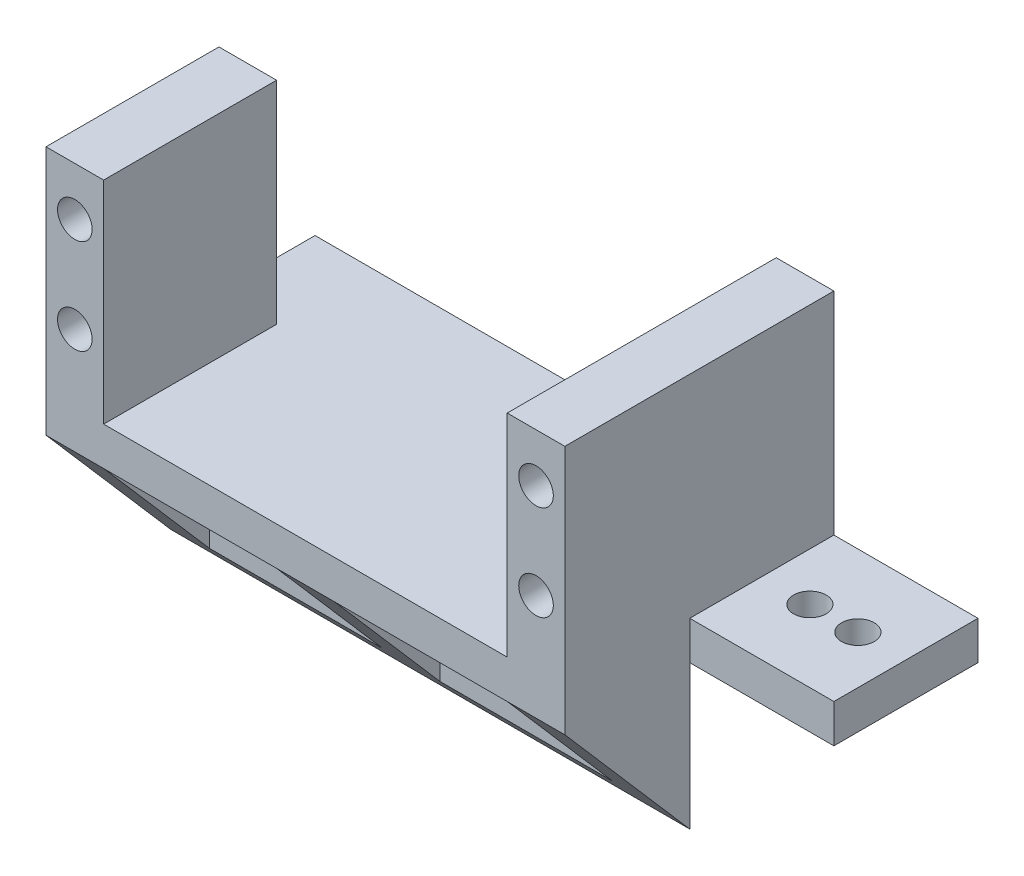
ISO-10303-21;
HEADER;
FILE_DESCRIPTION(('STEP AP214'),'2;1');
FILE_NAME('part.step','',(''),(''),'','','');
FILE_SCHEMA(('AUTOMOTIVE_DESIGN { 1 0 10303 214 1 1 1 1 }'));
ENDSEC;
DATA;
#1=APPLICATION_CONTEXT('core data for automotive mechanical design processes');
#2=APPLICATION_PROTOCOL_DEFINITION('international standard','automotive_design',2000,#1);
#3=PRODUCT_CONTEXT('',#1,'mechanical');
#4=PRODUCT('Part','Part','',(#3));
#5=PRODUCT_RELATED_PRODUCT_CATEGORY('part','',(#4));
#6=PRODUCT_DEFINITION_FORMATION('','',#4);
#7=PRODUCT_DEFINITION_CONTEXT('part definition',#1,'design');
#8=PRODUCT_DEFINITION('design','',#6,#7);
#9=PRODUCT_DEFINITION_SHAPE('','',#8);
#10=(LENGTH_UNIT() NAMED_UNIT(*) SI_UNIT(.MILLI.,.METRE.));
#11=(NAMED_UNIT(*) PLANE_ANGLE_UNIT() SI_UNIT($,.RADIAN.));
#12=(NAMED_UNIT(*) SI_UNIT($,.STERADIAN.) SOLID_ANGLE_UNIT());
#13=UNCERTAINTY_MEASURE_WITH_UNIT(LENGTH_MEASURE(1.E-05),#10,'distance_accuracy_value','');
#14=(GEOMETRIC_REPRESENTATION_CONTEXT(3) GLOBAL_UNCERTAINTY_ASSIGNED_CONTEXT((#13)) GLOBAL_UNIT_ASSIGNED_CONTEXT((#10,
#11,#12)) REPRESENTATION_CONTEXT('',''));
#15=CARTESIAN_POINT('',(0.,0.,0.));
#16=DIRECTION('',(0.,0.,1.));
#17=DIRECTION('',(1.,0.,0.));
#18=AXIS2_PLACEMENT_3D('',#15,#16,#17);
#19=CARTESIAN_POINT('',(0.,0.,-26.));
#20=DIRECTION('',(0.,0.,-1.));
#21=DIRECTION('',(1.,0.,0.));
#22=AXIS2_PLACEMENT_3D('',#19,#20,#21);
#23=PLANE('',#22);
#24=DIRECTION('',(0.,-1.,0.));
#25=VECTOR('',#24,1.);
#26=CARTESIAN_POINT('',(27.,26.,-26.));
#27=LINE('',#26,#25);
#28=CARTESIAN_POINT('',(27.,4.00000000000001,-26.));
#29=VERTEX_POINT('',#28);
#30=CARTESIAN_POINT('',(27.,0.,-26.));
#31=VERTEX_POINT('',#30);
#32=EDGE_CURVE('E294',#29,#31,#27,.T.);
#33=ORIENTED_EDGE('',*,*,#32,.T.);
#34=DIRECTION('',(-1.,0.,0.));
#35=VECTOR('',#34,1.);
#36=CARTESIAN_POINT('',(0.,0.,-26.));
#37=LINE('',#36,#35);
#38=CARTESIAN_POINT('',(42.,0.,-26.));
#39=VERTEX_POINT('',#38);
#40=EDGE_CURVE('E301',#39,#31,#37,.T.);
#41=ORIENTED_EDGE('',*,*,#40,.F.);
#42=DIRECTION('',(0.,-1.,0.));
#43=VECTOR('',#42,1.);
#44=CARTESIAN_POINT('',(42.,0.,-26.));
#45=LINE('',#44,#43);
#46=CARTESIAN_POINT('',(42.,4.00000000000001,-26.));
#47=VERTEX_POINT('',#46);
#48=EDGE_CURVE('E324',#47,#39,#45,.T.);
#49=ORIENTED_EDGE('',*,*,#48,.F.);
#50=DIRECTION('',(1.,0.,0.));
#51=VECTOR('',#50,1.);
#52=CARTESIAN_POINT('',(0.,4.00000000000001,-26.));
#53=LINE('',#52,#51);
#54=EDGE_CURVE('E306',#29,#47,#53,.T.);
#55=ORIENTED_EDGE('',*,*,#54,.F.);
#56=EDGE_LOOP('',(#33,#41,#49,#55));
#57=FACE_BOUND('',#56,.T.);
#58=ADVANCED_FACE('F37',(#57),#23,.F.);
#59=CARTESIAN_POINT('',(0.,0.,-41.));
#60=DIRECTION('',(0.,-1.,0.));
#61=DIRECTION('',(1.,0.,0.));
#62=AXIS2_PLACEMENT_3D('',#59,#60,#61);
#63=PLANE('',#62);
#64=DIRECTION('',(-1.,0.,0.));
#65=VECTOR('',#64,1.);
#66=CARTESIAN_POINT('',(27.,0.,-26.));
#67=LINE('',#66,#65);
#68=CARTESIAN_POINT('',(-27.,0.,-26.));
#69=VERTEX_POINT('',#68);
#70=EDGE_CURVE('E219',#31,#69,#67,.T.);
#71=ORIENTED_EDGE('',*,*,#70,.T.);
#72=DIRECTION('',(0.,0.,-1.));
#73=VECTOR('',#72,1.);
#74=CARTESIAN_POINT('',(-27.,0.,-13.));
#75=LINE('',#74,#73);
#76=CARTESIAN_POINT('',(-27.,0.,-41.));
#77=VERTEX_POINT('',#76);
#78=EDGE_CURVE('E293',#69,#77,#75,.T.);
#79=ORIENTED_EDGE('',*,*,#78,.T.);
#80=DIRECTION('',(-1.,0.,0.));
#81=VECTOR('',#80,1.);
#82=CARTESIAN_POINT('',(0.,0.,-41.));
#83=LINE('',#82,#81);
#84=CARTESIAN_POINT('',(42.,0.,-41.));
#85=VERTEX_POINT('',#84);
#86=EDGE_CURVE('E302',#85,#77,#83,.T.);
#87=ORIENTED_EDGE('',*,*,#86,.F.);
#88=DIRECTION('',(0.,0.,1.));
#89=VECTOR('',#88,1.);
#90=CARTESIAN_POINT('',(42.,0.,-41.));
#91=LINE('',#90,#89);
#92=EDGE_CURVE('E298',#85,#39,#91,.T.);
#93=ORIENTED_EDGE('',*,*,#92,.T.);
#94=ORIENTED_EDGE('',*,*,#40,.T.);
#95=EDGE_LOOP('',(#71,#79,#87,#93,#94));
#96=FACE_BOUND('',#95,.T.);
#97=CARTESIAN_POINT('',(37.,0.,-33.5));
#98=DIRECTION('',(0.,1.,0.));
#99=DIRECTION('',(1.,0.,0.));
#100=AXIS2_PLACEMENT_3D('',#97,#98,#99);
#101=CIRCLE('',#100,1.7);
#102=CARTESIAN_POINT('',(38.7,0.,-33.5));
#103=VERTEX_POINT('',#102);
#104=EDGE_CURVE('E246',#103,#103,#101,.T.);
#105=ORIENTED_EDGE('',*,*,#104,.T.);
#106=EDGE_LOOP('',(#105));
#107=FACE_BOUND('',#106,.T.);
#108=CARTESIAN_POINT('',(32.,0.,-33.5));
#109=DIRECTION('',(0.,1.,0.));
#110=DIRECTION('',(1.,0.,0.));
#111=AXIS2_PLACEMENT_3D('',#108,#109,#110);
#112=CIRCLE('',#111,1.7);
#113=CARTESIAN_POINT('',(33.7,0.,-33.5));
#114=VERTEX_POINT('',#113);
#115=EDGE_CURVE('E241',#114,#114,#112,.T.);
#116=ORIENTED_EDGE('',*,*,#115,.T.);
#117=EDGE_LOOP('',(#116));
#118=FACE_BOUND('',#117,.T.);
#119=ADVANCED_FACE('F39',(#96,#107,#118),#63,.T.);
#120=CARTESIAN_POINT('',(42.,0.,-41.));
#121=DIRECTION('',(1.,0.,0.));
#122=DIRECTION('',(0.,0.,1.));
#123=AXIS2_PLACEMENT_3D('',#120,#121,#122);
#124=PLANE('',#123);
#125=ORIENTED_EDGE('',*,*,#48,.T.);
#126=ORIENTED_EDGE('',*,*,#92,.F.);
#127=DIRECTION('',(0.,-1.,0.));
#128=VECTOR('',#127,1.);
#129=CARTESIAN_POINT('',(42.,0.,-41.));
#130=LINE('',#129,#128);
#131=CARTESIAN_POINT('',(42.,4.00000000000001,-41.));
#132=VERTEX_POINT('',#131);
#133=EDGE_CURVE('E305',#132,#85,#130,.T.);
#134=ORIENTED_EDGE('',*,*,#133,.F.);
#135=DIRECTION('',(0.,0.,1.));
#136=VECTOR('',#135,1.);
#137=CARTESIAN_POINT('',(42.,4.00000000000001,-41.));
#138=LINE('',#137,#136);
#139=EDGE_CURVE('E348',#132,#47,#138,.T.);
#140=ORIENTED_EDGE('',*,*,#139,.T.);
#141=EDGE_LOOP('',(#125,#126,#134,#140));
#142=FACE_BOUND('',#141,.T.);
#143=ADVANCED_FACE('F385',(#142),#124,.T.);
#144=CARTESIAN_POINT('',(0.,4.00000000000001,-41.));
#145=DIRECTION('',(0.,1.,0.));
#146=DIRECTION('',(-1.,0.,0.));
#147=AXIS2_PLACEMENT_3D('',#144,#145,#146);
#148=PLANE('',#147);
#149=CARTESIAN_POINT('',(37.,4.00000000000001,-33.5));
#150=DIRECTION('',(0.,-1.,0.));
#151=DIRECTION('',(-1.,0.,0.));
#152=AXIS2_PLACEMENT_3D('',#149,#150,#151);
#153=CIRCLE('',#152,1.7);
#154=CARTESIAN_POINT('',(35.3,4.00000000000001,-33.5));
#155=VERTEX_POINT('',#154);
#156=EDGE_CURVE('E238',#155,#155,#153,.T.);
#157=ORIENTED_EDGE('',*,*,#156,.T.);
#158=EDGE_LOOP('',(#157));
#159=FACE_BOUND('',#158,.T.);
#160=CARTESIAN_POINT('',(32.,4.00000000000001,-33.5));
#161=DIRECTION('',(0.,-1.,0.));
#162=DIRECTION('',(-1.,0.,0.));
#163=AXIS2_PLACEMENT_3D('',#160,#161,#162);
#164=CIRCLE('',#163,1.7);
#165=CARTESIAN_POINT('',(30.3,4.00000000000001,-33.5));
#166=VERTEX_POINT('',#165);
#167=EDGE_CURVE('E235',#166,#166,#164,.T.);
#168=ORIENTED_EDGE('',*,*,#167,.T.);
#169=EDGE_LOOP('',(#168));
#170=FACE_BOUND('',#169,.T.);
#171=ORIENTED_EDGE('',*,*,#54,.T.);
#172=ORIENTED_EDGE('',*,*,#139,.F.);
#173=DIRECTION('',(1.,0.,0.));
#174=VECTOR('',#173,1.);
#175=CARTESIAN_POINT('',(0.,4.00000000000001,-41.));
#176=LINE('',#175,#174);
#177=CARTESIAN_POINT('',(27.,4.00000000000001,-41.));
#178=VERTEX_POINT('',#177);
#179=EDGE_CURVE('E308',#178,#132,#176,.T.);
#180=ORIENTED_EDGE('',*,*,#179,.F.);
#181=DIRECTION('',(0.,0.,1.));
#182=VECTOR('',#181,1.);
#183=CARTESIAN_POINT('',(27.,4.00000000000001,-41.));
#184=LINE('',#183,#182);
#185=EDGE_CURVE('E346',#178,#29,#184,.T.);
#186=ORIENTED_EDGE('',*,*,#185,.T.);
#187=EDGE_LOOP('',(#171,#172,#180,#186));
#188=FACE_BOUND('',#187,.T.);
#189=ADVANCED_FACE('F418',(#159,#170,#188),#148,.T.);
#190=CARTESIAN_POINT('',(27.,0.,-41.));
#191=DIRECTION('',(1.,0.,0.));
#192=DIRECTION('',(0.,1.,0.));
#193=AXIS2_PLACEMENT_3D('',#190,#191,#192);
#194=PLANE('',#193);
#195=ORIENTED_EDGE('',*,*,#185,.F.);
#196=DIRECTION('',(0.,-1.,0.));
#197=VECTOR('',#196,1.);
#198=CARTESIAN_POINT('',(27.,0.,-41.));
#199=LINE('',#198,#197);
#200=CARTESIAN_POINT('',(27.,26.,-41.));
#201=VERTEX_POINT('',#200);
#202=EDGE_CURVE('E310',#201,#178,#199,.T.);
#203=ORIENTED_EDGE('',*,*,#202,.F.);
#204=DIRECTION('',(0.,0.,1.));
#205=VECTOR('',#204,1.);
#206=CARTESIAN_POINT('',(27.,26.,-41.));
#207=LINE('',#206,#205);
#208=CARTESIAN_POINT('',(27.,26.,-13.));
#209=VERTEX_POINT('',#208);
#210=EDGE_CURVE('E343',#201,#209,#207,.T.);
#211=ORIENTED_EDGE('',*,*,#210,.T.);
#212=DIRECTION('',(0.,-1.,0.));
#213=VECTOR('',#212,1.);
#214=CARTESIAN_POINT('',(27.,26.,-13.));
#215=LINE('',#214,#213);
#216=CARTESIAN_POINT('',(27.,0.,-13.));
#217=VERTEX_POINT('',#216);
#218=EDGE_CURVE('E275',#209,#217,#215,.T.);
#219=ORIENTED_EDGE('',*,*,#218,.T.);
#220=DIRECTION('',(0.,-0.755689082789818,-0.654930538417842));
#221=VECTOR('',#220,1.);
#222=CARTESIAN_POINT('',(27.,-15.,-26.));
#223=LINE('',#222,#221);
#224=CARTESIAN_POINT('',(27.,-15.,-26.));
#225=VERTEX_POINT('',#224);
#226=EDGE_CURVE('E209',#217,#225,#223,.T.);
#227=ORIENTED_EDGE('',*,*,#226,.T.);
#228=DIRECTION('',(0.,1.,0.));
#229=VECTOR('',#228,1.);
#230=CARTESIAN_POINT('',(27.,0.,-26.));
#231=LINE('',#230,#229);
#232=EDGE_CURVE('E212',#225,#31,#231,.T.);
#233=ORIENTED_EDGE('',*,*,#232,.T.);
#234=ORIENTED_EDGE('',*,*,#32,.F.);
#235=EDGE_LOOP('',(#195,#203,#211,#219,#227,#233,#234));
#236=FACE_BOUND('',#235,.T.);
#237=ADVANCED_FACE('F414',(#236),#194,.T.);
#238=CARTESIAN_POINT('',(0.,26.,-41.));
#239=DIRECTION('',(0.,1.,0.));
#240=DIRECTION('',(-1.,0.,0.));
#241=AXIS2_PLACEMENT_3D('',#238,#239,#240);
#242=PLANE('',#241);
#243=ORIENTED_EDGE('',*,*,#210,.F.);
#244=DIRECTION('',(1.,0.,0.));
#245=VECTOR('',#244,1.);
#246=CARTESIAN_POINT('',(0.,26.,-41.));
#247=LINE('',#246,#245);
#248=CARTESIAN_POINT('',(21.,26.,-41.));
#249=VERTEX_POINT('',#248);
#250=EDGE_CURVE('E312',#249,#201,#247,.T.);
#251=ORIENTED_EDGE('',*,*,#250,.F.);
#252=DIRECTION('',(0.,0.,1.));
#253=VECTOR('',#252,1.);
#254=CARTESIAN_POINT('',(21.,26.,-41.));
#255=LINE('',#254,#253);
#256=CARTESIAN_POINT('',(21.,26.,-13.));
#257=VERTEX_POINT('',#256);
#258=EDGE_CURVE('E340',#249,#257,#255,.T.);
#259=ORIENTED_EDGE('',*,*,#258,.T.);
#260=DIRECTION('',(1.,0.,0.));
#261=VECTOR('',#260,1.);
#262=CARTESIAN_POINT('',(27.,26.,-13.));
#263=LINE('',#262,#261);
#264=EDGE_CURVE('E271',#257,#209,#263,.T.);
#265=ORIENTED_EDGE('',*,*,#264,.T.);
#266=EDGE_LOOP('',(#243,#251,#259,#265));
#267=FACE_BOUND('',#266,.T.);
#268=ADVANCED_FACE('F410',(#267),#242,.T.);
#269=CARTESIAN_POINT('',(21.,0.,-41.));
#270=DIRECTION('',(-1.,0.,0.));
#271=DIRECTION('',(0.,0.,-1.));
#272=AXIS2_PLACEMENT_3D('',#269,#270,#271);
#273=PLANE('',#272);
#274=ORIENTED_EDGE('',*,*,#258,.F.);
#275=DIRECTION('',(0.,1.,0.));
#276=VECTOR('',#275,1.);
#277=CARTESIAN_POINT('',(21.,0.,-41.));
#278=LINE('',#277,#276);
#279=CARTESIAN_POINT('',(21.,4.00000000000001,-41.));
#280=VERTEX_POINT('',#279);
#281=EDGE_CURVE('E314',#280,#249,#278,.T.);
#282=ORIENTED_EDGE('',*,*,#281,.F.);
#283=DIRECTION('',(0.,0.,1.));
#284=VECTOR('',#283,1.);
#285=CARTESIAN_POINT('',(21.,4.00000000000001,-41.));
#286=LINE('',#285,#284);
#287=CARTESIAN_POINT('',(21.,4.00000000000001,-13.));
#288=VERTEX_POINT('',#287);
#289=EDGE_CURVE('E337',#280,#288,#286,.T.);
#290=ORIENTED_EDGE('',*,*,#289,.T.);
#291=DIRECTION('',(0.,1.,0.));
#292=VECTOR('',#291,1.);
#293=CARTESIAN_POINT('',(21.,26.,-13.));
#294=LINE('',#293,#292);
#295=EDGE_CURVE('E291',#288,#257,#294,.T.);
#296=ORIENTED_EDGE('',*,*,#295,.T.);
#297=EDGE_LOOP('',(#274,#282,#290,#296));
#298=FACE_BOUND('',#297,.T.);
#299=ADVANCED_FACE('F406',(#298),#273,.T.);
#300=CARTESIAN_POINT('',(0.,4.00000000000001,-41.));
#301=DIRECTION('',(0.,-1.,0.));
#302=DIRECTION('',(0.,0.,1.));
#303=AXIS2_PLACEMENT_3D('',#300,#301,#302);
#304=PLANE('',#303);
#305=ORIENTED_EDGE('',*,*,#289,.F.);
#306=DIRECTION('',(-1.,0.,0.));
#307=VECTOR('',#306,1.);
#308=CARTESIAN_POINT('',(0.,4.00000000000001,-41.));
#309=LINE('',#308,#307);
#310=CARTESIAN_POINT('',(-27.,4.,-41.));
#311=VERTEX_POINT('',#310);
#312=EDGE_CURVE('E316',#280,#311,#309,.T.);
#313=ORIENTED_EDGE('',*,*,#312,.T.);
#314=DIRECTION('',(0.,0.,-1.));
#315=VECTOR('',#314,1.);
#316=CARTESIAN_POINT('',(-27.,4.,-41.));
#317=LINE('',#316,#315);
#318=CARTESIAN_POINT('',(-27.,4.,-31.));
#319=VERTEX_POINT('',#318);
#320=EDGE_CURVE('E227',#319,#311,#317,.T.);
#321=ORIENTED_EDGE('',*,*,#320,.F.);
#322=DIRECTION('',(-1.,0.,0.));
#323=VECTOR('',#322,1.);
#324=CARTESIAN_POINT('',(-27.,4.,-31.));
#325=LINE('',#324,#323);
#326=CARTESIAN_POINT('',(-21.,4.,-31.));
#327=VERTEX_POINT('',#326);
#328=EDGE_CURVE('E224',#327,#319,#325,.T.);
#329=ORIENTED_EDGE('',*,*,#328,.F.);
#330=DIRECTION('',(0.,0.,1.));
#331=VECTOR('',#330,1.);
#332=CARTESIAN_POINT('',(-21.,4.00000000000001,-41.));
#333=LINE('',#332,#331);
#334=CARTESIAN_POINT('',(-21.,4.00000000000001,-13.));
#335=VERTEX_POINT('',#334);
#336=EDGE_CURVE('E334',#327,#335,#333,.T.);
#337=ORIENTED_EDGE('',*,*,#336,.T.);
#338=DIRECTION('',(1.,0.,0.));
#339=VECTOR('',#338,1.);
#340=CARTESIAN_POINT('',(21.,4.00000000000001,-13.));
#341=LINE('',#340,#339);
#342=EDGE_CURVE('E289',#335,#288,#341,.T.);
#343=ORIENTED_EDGE('',*,*,#342,.T.);
#344=EDGE_LOOP('',(#305,#313,#321,#329,#337,#343));
#345=FACE_BOUND('',#344,.T.);
#346=ADVANCED_FACE('F402',(#345),#304,.F.);
#347=CARTESIAN_POINT('',(-21.,0.,-41.));
#348=DIRECTION('',(-1.,0.,0.));
#349=DIRECTION('',(0.,-1.,0.));
#350=AXIS2_PLACEMENT_3D('',#347,#348,#349);
#351=PLANE('',#350);
#352=DIRECTION('',(0.,0.,1.));
#353=VECTOR('',#352,1.);
#354=CARTESIAN_POINT('',(-21.,26.,-41.));
#355=LINE('',#354,#353);
#356=CARTESIAN_POINT('',(-21.,26.,-31.));
#357=VERTEX_POINT('',#356);
#358=CARTESIAN_POINT('',(-21.,26.,-13.));
#359=VERTEX_POINT('',#358);
#360=EDGE_CURVE('E331',#357,#359,#355,.T.);
#361=ORIENTED_EDGE('',*,*,#360,.T.);
#362=DIRECTION('',(0.,-1.,0.));
#363=VECTOR('',#362,1.);
#364=CARTESIAN_POINT('',(-21.,4.00000000000001,-13.));
#365=LINE('',#364,#363);
#366=EDGE_CURVE('E287',#359,#335,#365,.T.);
#367=ORIENTED_EDGE('',*,*,#366,.T.);
#368=ORIENTED_EDGE('',*,*,#336,.F.);
#369=DIRECTION('',(0.,1.,0.));
#370=VECTOR('',#369,1.);
#371=CARTESIAN_POINT('',(-21.,4.,-31.));
#372=LINE('',#371,#370);
#373=EDGE_CURVE('E230',#327,#357,#372,.T.);
#374=ORIENTED_EDGE('',*,*,#373,.T.);
#375=EDGE_LOOP('',(#361,#367,#368,#374));
#376=FACE_BOUND('',#375,.T.);
#377=ADVANCED_FACE('F398',(#376),#351,.F.);
#378=CARTESIAN_POINT('',(0.,26.,-41.));
#379=DIRECTION('',(0.,-1.,0.));
#380=DIRECTION('',(0.,0.,1.));
#381=AXIS2_PLACEMENT_3D('',#378,#379,#380);
#382=PLANE('',#381);
#383=DIRECTION('',(0.,0.,1.));
#384=VECTOR('',#383,1.);
#385=CARTESIAN_POINT('',(-27.,26.,-41.));
#386=LINE('',#385,#384);
#387=CARTESIAN_POINT('',(-27.,26.,-31.));
#388=VERTEX_POINT('',#387);
#389=CARTESIAN_POINT('',(-27.,26.,-13.));
#390=VERTEX_POINT('',#389);
#391=EDGE_CURVE('E321',#388,#390,#386,.T.);
#392=ORIENTED_EDGE('',*,*,#391,.T.);
#393=DIRECTION('',(1.,0.,0.));
#394=VECTOR('',#393,1.);
#395=CARTESIAN_POINT('',(-21.,26.,-13.));
#396=LINE('',#395,#394);
#397=EDGE_CURVE('E285',#390,#359,#396,.T.);
#398=ORIENTED_EDGE('',*,*,#397,.T.);
#399=ORIENTED_EDGE('',*,*,#360,.F.);
#400=DIRECTION('',(-1.,0.,0.));
#401=VECTOR('',#400,1.);
#402=CARTESIAN_POINT('',(-27.,26.,-31.));
#403=LINE('',#402,#401);
#404=EDGE_CURVE('E222',#357,#388,#403,.T.);
#405=ORIENTED_EDGE('',*,*,#404,.T.);
#406=EDGE_LOOP('',(#392,#398,#399,#405));
#407=FACE_BOUND('',#406,.T.);
#408=ADVANCED_FACE('F394',(#407),#382,.F.);
#409=CARTESIAN_POINT('',(-27.,0.,-41.));
#410=DIRECTION('',(1.,0.,0.));
#411=DIRECTION('',(0.,1.,0.));
#412=AXIS2_PLACEMENT_3D('',#409,#410,#411);
#413=PLANE('',#412);
#414=ORIENTED_EDGE('',*,*,#320,.T.);
#415=DIRECTION('',(0.,-1.,0.));
#416=VECTOR('',#415,1.);
#417=CARTESIAN_POINT('',(-27.,0.,-41.));
#418=LINE('',#417,#416);
#419=EDGE_CURVE('E319',#311,#77,#418,.T.);
#420=ORIENTED_EDGE('',*,*,#419,.T.);
#421=ORIENTED_EDGE('',*,*,#78,.F.);
#422=DIRECTION('',(0.,1.,0.));
#423=VECTOR('',#422,1.);
#424=CARTESIAN_POINT('',(-27.,0.,-26.));
#425=LINE('',#424,#423);
#426=CARTESIAN_POINT('',(-27.,-15.,-26.));
#427=VERTEX_POINT('',#426);
#428=EDGE_CURVE('E213',#427,#69,#425,.T.);
#429=ORIENTED_EDGE('',*,*,#428,.F.);
#430=DIRECTION('',(0.,-0.755689082789818,-0.654930538417842));
#431=VECTOR('',#430,1.);
#432=CARTESIAN_POINT('',(-27.,-15.,-26.));
#433=LINE('',#432,#431);
#434=CARTESIAN_POINT('',(-27.,0.,-13.));
#435=VERTEX_POINT('',#434);
#436=EDGE_CURVE('E191',#435,#427,#433,.T.);
#437=ORIENTED_EDGE('',*,*,#436,.F.);
#438=DIRECTION('',(0.,1.,0.));
#439=VECTOR('',#438,1.);
#440=CARTESIAN_POINT('',(-27.,4.00000000000001,-13.));
#441=LINE('',#440,#439);
#442=EDGE_CURVE('E282',#435,#390,#441,.T.);
#443=ORIENTED_EDGE('',*,*,#442,.T.);
#444=ORIENTED_EDGE('',*,*,#391,.F.);
#445=DIRECTION('',(0.,1.,0.));
#446=VECTOR('',#445,1.);
#447=CARTESIAN_POINT('',(-27.,4.,-31.));
#448=LINE('',#447,#446);
#449=EDGE_CURVE('E233',#319,#388,#448,.T.);
#450=ORIENTED_EDGE('',*,*,#449,.F.);
#451=EDGE_LOOP('',(#414,#420,#421,#429,#437,#443,#444,#450));
#452=FACE_BOUND('',#451,.T.);
#453=ADVANCED_FACE('F391',(#452),#413,.F.);
#454=CARTESIAN_POINT('',(0.,0.,-41.));
#455=DIRECTION('',(0.,0.,-1.));
#456=DIRECTION('',(1.,0.,0.));
#457=AXIS2_PLACEMENT_3D('',#454,#455,#456);
#458=PLANE('',#457);
#459=ORIENTED_EDGE('',*,*,#312,.F.);
#460=ORIENTED_EDGE('',*,*,#281,.T.);
#461=ORIENTED_EDGE('',*,*,#250,.T.);
#462=ORIENTED_EDGE('',*,*,#202,.T.);
#463=ORIENTED_EDGE('',*,*,#179,.T.);
#464=ORIENTED_EDGE('',*,*,#133,.T.);
#465=ORIENTED_EDGE('',*,*,#86,.T.);
#466=ORIENTED_EDGE('',*,*,#419,.F.);
#467=EDGE_LOOP('',(#459,#460,#461,#462,#463,#464,#465,#466));
#468=FACE_BOUND('',#467,.T.);
#469=ADVANCED_FACE('F389',(#468),#458,.T.);
#470=CARTESIAN_POINT('',(0.,0.,-13.));
#471=DIRECTION('',(0.,0.,-1.));
#472=DIRECTION('',(1.,0.,0.));
#473=AXIS2_PLACEMENT_3D('',#470,#471,#472);
#474=PLANE('',#473);
#475=CARTESIAN_POINT('',(-24.,20.95,-13.));
#476=DIRECTION('',(0.,0.,-1.));
#477=DIRECTION('',(-1.,0.,0.));
#478=AXIS2_PLACEMENT_3D('',#475,#476,#477);
#479=CIRCLE('',#478,1.8);
#480=CARTESIAN_POINT('',(-25.8,20.95,-13.));
#481=VERTEX_POINT('',#480);
#482=EDGE_CURVE('E256',#481,#481,#479,.T.);
#483=ORIENTED_EDGE('',*,*,#482,.T.);
#484=EDGE_LOOP('',(#483));
#485=FACE_BOUND('',#484,.T.);
#486=CARTESIAN_POINT('',(24.,11.05,-13.));
#487=DIRECTION('',(0.,0.,-1.));
#488=DIRECTION('',(-1.,0.,0.));
#489=AXIS2_PLACEMENT_3D('',#486,#487,#488);
#490=CIRCLE('',#489,1.8);
#491=CARTESIAN_POINT('',(22.2,11.05,-13.));
#492=VERTEX_POINT('',#491);
#493=EDGE_CURVE('E263',#492,#492,#490,.T.);
#494=ORIENTED_EDGE('',*,*,#493,.T.);
#495=EDGE_LOOP('',(#494));
#496=FACE_BOUND('',#495,.T.);
#497=CARTESIAN_POINT('',(24.,20.95,-13.));
#498=DIRECTION('',(0.,0.,-1.));
#499=DIRECTION('',(-1.,0.,0.));
#500=AXIS2_PLACEMENT_3D('',#497,#498,#499);
#501=CIRCLE('',#500,1.8);
#502=CARTESIAN_POINT('',(22.2,20.95,-13.));
#503=VERTEX_POINT('',#502);
#504=EDGE_CURVE('E250',#503,#503,#501,.T.);
#505=ORIENTED_EDGE('',*,*,#504,.T.);
#506=EDGE_LOOP('',(#505));
#507=FACE_BOUND('',#506,.T.);
#508=CARTESIAN_POINT('',(-24.,11.05,-13.));
#509=DIRECTION('',(0.,0.,-1.));
#510=DIRECTION('',(-1.,0.,0.));
#511=AXIS2_PLACEMENT_3D('',#508,#509,#510);
#512=CIRCLE('',#511,1.8);
#513=CARTESIAN_POINT('',(-25.8,11.05,-13.));
#514=VERTEX_POINT('',#513);
#515=EDGE_CURVE('E259',#514,#514,#512,.T.);
#516=ORIENTED_EDGE('',*,*,#515,.T.);
#517=EDGE_LOOP('',(#516));
#518=FACE_BOUND('',#517,.T.);
#519=ORIENTED_EDGE('',*,*,#264,.F.);
#520=ORIENTED_EDGE('',*,*,#295,.F.);
#521=ORIENTED_EDGE('',*,*,#342,.F.);
#522=ORIENTED_EDGE('',*,*,#366,.F.);
#523=ORIENTED_EDGE('',*,*,#397,.F.);
#524=ORIENTED_EDGE('',*,*,#442,.F.);
#525=DIRECTION('',(-1.,0.,0.));
#526=VECTOR('',#525,1.);
#527=CARTESIAN_POINT('',(-27.,0.,-13.));
#528=LINE('',#527,#526);
#529=CARTESIAN_POINT('',(-21.,0.,-13.));
#530=VERTEX_POINT('',#529);
#531=EDGE_CURVE('E278',#530,#435,#528,.T.);
#532=ORIENTED_EDGE('',*,*,#531,.F.);
#533=DIRECTION('',(-1.,0.,0.));
#534=VECTOR('',#533,1.);
#535=CARTESIAN_POINT('',(0.,0.,-13.));
#536=LINE('',#535,#534);
#537=CARTESIAN_POINT('',(-3.,0.,-13.));
#538=VERTEX_POINT('',#537);
#539=EDGE_CURVE('E199',#538,#530,#536,.T.);
#540=ORIENTED_EDGE('',*,*,#539,.F.);
#541=CARTESIAN_POINT('',(3.,0.,-13.));
#542=VERTEX_POINT('',#541);
#543=EDGE_CURVE('E283',#542,#538,#528,.T.);
#544=ORIENTED_EDGE('',*,*,#543,.F.);
#545=DIRECTION('',(-1.,0.,0.));
#546=VECTOR('',#545,1.);
#547=CARTESIAN_POINT('',(0.,0.,-13.));
#548=LINE('',#547,#546);
#549=CARTESIAN_POINT('',(21.,0.,-13.));
#550=VERTEX_POINT('',#549);
#551=EDGE_CURVE('E177',#550,#542,#548,.T.);
#552=ORIENTED_EDGE('',*,*,#551,.F.);
#553=EDGE_CURVE('E279',#217,#550,#528,.T.);
#554=ORIENTED_EDGE('',*,*,#553,.F.);
#555=ORIENTED_EDGE('',*,*,#218,.F.);
#556=EDGE_LOOP('',(#519,#520,#521,#522,#523,#524,#532,#540,#544,#552,#554,#555));
#557=FACE_BOUND('',#556,.T.);
#558=ADVANCED_FACE('F459',(#485,#496,#507,#518,#557),#474,.F.);
#559=CARTESIAN_POINT('',(-24.,11.05,-23.));
#560=DIRECTION('',(0.,0.,1.));
#561=DIRECTION('',(-1.,0.,0.));
#562=AXIS2_PLACEMENT_3D('',#559,#560,#561);
#563=CYLINDRICAL_SURFACE('',#562,1.8);
#564=CARTESIAN_POINT('',(-24.,11.05,-23.));
#565=DIRECTION('',(0.,0.,-1.));
#566=DIRECTION('',(-1.,0.,0.));
#567=AXIS2_PLACEMENT_3D('',#564,#565,#566);
#568=CIRCLE('',#567,1.8);
#569=CARTESIAN_POINT('',(-25.8,11.05,-23.));
#570=VERTEX_POINT('',#569);
#571=EDGE_CURVE('E268',#570,#570,#568,.T.);
#572=ORIENTED_EDGE('',*,*,#571,.T.);
#573=EDGE_LOOP('',(#572));
#574=FACE_BOUND('',#573,.T.);
#575=ORIENTED_EDGE('',*,*,#515,.F.);
#576=EDGE_LOOP('',(#575));
#577=FACE_BOUND('',#576,.T.);
#578=ADVANCED_FACE('F512',(#574,#577),#563,.F.);
#579=CARTESIAN_POINT('',(-24.,11.05,-23.));
#580=DIRECTION('',(0.,0.,1.));
#581=DIRECTION('',(-1.,0.,0.));
#582=AXIS2_PLACEMENT_3D('',#579,#580,#581);
#583=PLANE('',#582);
#584=ORIENTED_EDGE('',*,*,#571,.F.);
#585=EDGE_LOOP('',(#584));
#586=FACE_BOUND('',#585,.T.);
#587=ADVANCED_FACE('F490',(#586),#583,.T.);
#588=CARTESIAN_POINT('',(24.,20.95,-23.));
#589=DIRECTION('',(0.,0.,1.));
#590=DIRECTION('',(-1.,0.,0.));
#591=AXIS2_PLACEMENT_3D('',#588,#589,#590);
#592=CYLINDRICAL_SURFACE('',#591,1.8);
#593=ORIENTED_EDGE('',*,*,#504,.F.);
#594=EDGE_LOOP('',(#593));
#595=FACE_BOUND('',#594,.T.);
#596=CARTESIAN_POINT('',(24.,20.95,-23.));
#597=DIRECTION('',(0.,0.,-1.));
#598=DIRECTION('',(-1.,0.,0.));
#599=AXIS2_PLACEMENT_3D('',#596,#597,#598);
#600=CIRCLE('',#599,1.8);
#601=CARTESIAN_POINT('',(22.2,20.95,-23.));
#602=VERTEX_POINT('',#601);
#603=EDGE_CURVE('E249',#602,#602,#600,.T.);
#604=ORIENTED_EDGE('',*,*,#603,.T.);
#605=EDGE_LOOP('',(#604));
#606=FACE_BOUND('',#605,.T.);
#607=ADVANCED_FACE('F486',(#595,#606),#592,.F.);
#608=CARTESIAN_POINT('',(0.,0.,-23.));
#609=DIRECTION('',(0.,0.,1.));
#610=DIRECTION('',(-1.,0.,0.));
#611=AXIS2_PLACEMENT_3D('',#608,#609,#610);
#612=PLANE('',#611);
#613=ORIENTED_EDGE('',*,*,#603,.F.);
#614=EDGE_LOOP('',(#613));
#615=FACE_BOUND('',#614,.T.);
#616=ADVANCED_FACE('F489',(#615),#612,.T.);
#617=CARTESIAN_POINT('',(24.,11.05,-23.));
#618=DIRECTION('',(0.,0.,1.));
#619=DIRECTION('',(-1.,0.,0.));
#620=AXIS2_PLACEMENT_3D('',#617,#618,#619);
#621=CYLINDRICAL_SURFACE('',#620,1.8);
#622=CARTESIAN_POINT('',(24.,11.05,-23.));
#623=DIRECTION('',(0.,0.,-1.));
#624=DIRECTION('',(-1.,0.,0.));
#625=AXIS2_PLACEMENT_3D('',#622,#623,#624);
#626=CIRCLE('',#625,1.8);
#627=CARTESIAN_POINT('',(22.2,11.05,-23.));
#628=VERTEX_POINT('',#627);
#629=EDGE_CURVE('E253',#628,#628,#626,.T.);
#630=ORIENTED_EDGE('',*,*,#629,.T.);
#631=EDGE_LOOP('',(#630));
#632=FACE_BOUND('',#631,.T.);
#633=ORIENTED_EDGE('',*,*,#493,.F.);
#634=EDGE_LOOP('',(#633));
#635=FACE_BOUND('',#634,.T.);
#636=ADVANCED_FACE('F494',(#632,#635),#621,.F.);
#637=CARTESIAN_POINT('',(24.,11.05,-23.));
#638=DIRECTION('',(0.,0.,1.));
#639=DIRECTION('',(-1.,0.,0.));
#640=AXIS2_PLACEMENT_3D('',#637,#638,#639);
#641=PLANE('',#640);
#642=ORIENTED_EDGE('',*,*,#629,.F.);
#643=EDGE_LOOP('',(#642));
#644=FACE_BOUND('',#643,.T.);
#645=ADVANCED_FACE('F499',(#644),#641,.T.);
#646=CARTESIAN_POINT('',(-24.,20.95,-23.));
#647=DIRECTION('',(0.,0.,1.));
#648=DIRECTION('',(-1.,0.,0.));
#649=AXIS2_PLACEMENT_3D('',#646,#647,#648);
#650=CYLINDRICAL_SURFACE('',#649,1.8);
#651=CARTESIAN_POINT('',(-24.,20.95,-23.));
#652=DIRECTION('',(0.,0.,-1.));
#653=DIRECTION('',(-1.,0.,0.));
#654=AXIS2_PLACEMENT_3D('',#651,#652,#653);
#655=CIRCLE('',#654,1.8);
#656=CARTESIAN_POINT('',(-25.8,20.95,-23.));
#657=VERTEX_POINT('',#656);
#658=EDGE_CURVE('E260',#657,#657,#655,.T.);
#659=ORIENTED_EDGE('',*,*,#658,.T.);
#660=EDGE_LOOP('',(#659));
#661=FACE_BOUND('',#660,.T.);
#662=ORIENTED_EDGE('',*,*,#482,.F.);
#663=EDGE_LOOP('',(#662));
#664=FACE_BOUND('',#663,.T.);
#665=ADVANCED_FACE('F496',(#661,#664),#650,.F.);
#666=CARTESIAN_POINT('',(-24.,20.95,-23.));
#667=DIRECTION('',(0.,0.,1.));
#668=DIRECTION('',(-1.,0.,0.));
#669=AXIS2_PLACEMENT_3D('',#666,#667,#668);
#670=PLANE('',#669);
#671=ORIENTED_EDGE('',*,*,#658,.F.);
#672=EDGE_LOOP('',(#671));
#673=FACE_BOUND('',#672,.T.);
#674=ADVANCED_FACE('F484',(#673),#670,.T.);
#675=CARTESIAN_POINT('',(32.,-11.,-33.5));
#676=DIRECTION('',(0.,1.,0.));
#677=DIRECTION('',(-1.,0.,0.));
#678=AXIS2_PLACEMENT_3D('',#675,#676,#677);
#679=CYLINDRICAL_SURFACE('',#678,1.7);
#680=ORIENTED_EDGE('',*,*,#115,.F.);
#681=EDGE_LOOP('',(#680));
#682=FACE_BOUND('',#681,.T.);
#683=ORIENTED_EDGE('',*,*,#167,.F.);
#684=EDGE_LOOP('',(#683));
#685=FACE_BOUND('',#684,.T.);
#686=ADVANCED_FACE('F477',(#682,#685),#679,.F.);
#687=CARTESIAN_POINT('',(37.,-11.,-33.5));
#688=DIRECTION('',(0.,1.,0.));
#689=DIRECTION('',(-1.,0.,0.));
#690=AXIS2_PLACEMENT_3D('',#687,#688,#689);
#691=CYLINDRICAL_SURFACE('',#690,1.7);
#692=ORIENTED_EDGE('',*,*,#104,.F.);
#693=EDGE_LOOP('',(#692));
#694=FACE_BOUND('',#693,.T.);
#695=ORIENTED_EDGE('',*,*,#156,.F.);
#696=EDGE_LOOP('',(#695));
#697=FACE_BOUND('',#696,.T.);
#698=ADVANCED_FACE('F470',(#694,#697),#691,.F.);
#699=CARTESIAN_POINT('',(-27.,4.,-31.));
#700=DIRECTION('',(0.,0.,1.));
#701=DIRECTION('',(-1.,0.,0.));
#702=AXIS2_PLACEMENT_3D('',#699,#700,#701);
#703=PLANE('',#702);
#704=ORIENTED_EDGE('',*,*,#404,.F.);
#705=ORIENTED_EDGE('',*,*,#373,.F.);
#706=ORIENTED_EDGE('',*,*,#328,.T.);
#707=ORIENTED_EDGE('',*,*,#449,.T.);
#708=EDGE_LOOP('',(#704,#705,#706,#707));
#709=FACE_BOUND('',#708,.T.);
#710=ADVANCED_FACE('F467',(#709),#703,.F.);
#711=CARTESIAN_POINT('',(27.,-15.,-26.));
#712=DIRECTION('',(0.,-0.654930538417842,0.755689082789817));
#713=DIRECTION('',(0.,0.755689082789818,0.654930538417842));
#714=AXIS2_PLACEMENT_3D('',#711,#712,#713);
#715=PLANE('',#714);
#716=DIRECTION('',(0.,-0.755689082789818,-0.654930538417842));
#717=VECTOR('',#716,1.);
#718=CARTESIAN_POINT('',(21.,-15.,-26.));
#719=LINE('',#718,#717);
#720=CARTESIAN_POINT('',(21.,-12.6923076923077,-24.));
#721=VERTEX_POINT('',#720);
#722=EDGE_CURVE('E11',#550,#721,#719,.T.);
#723=ORIENTED_EDGE('',*,*,#722,.T.);
#724=DIRECTION('',(1.,0.,0.));
#725=VECTOR('',#724,1.);
#726=CARTESIAN_POINT('',(27.,-12.6923076923077,-24.));
#727=LINE('',#726,#725);
#728=CARTESIAN_POINT('',(3.,-12.6923076923077,-24.));
#729=VERTEX_POINT('',#728);
#730=EDGE_CURVE('E358',#729,#721,#727,.T.);
#731=ORIENTED_EDGE('',*,*,#730,.F.);
#732=DIRECTION('',(0.,0.755689082789818,0.654930538417842));
#733=VECTOR('',#732,1.);
#734=CARTESIAN_POINT('',(3.,-15.,-26.));
#735=LINE('',#734,#733);
#736=EDGE_CURVE('E45',#729,#542,#735,.T.);
#737=ORIENTED_EDGE('',*,*,#736,.T.);
#738=ORIENTED_EDGE('',*,*,#543,.T.);
#739=DIRECTION('',(0.,-0.755689082789818,-0.654930538417842));
#740=VECTOR('',#739,1.);
#741=CARTESIAN_POINT('',(-3.,-15.,-26.));
#742=LINE('',#741,#740);
#743=CARTESIAN_POINT('',(-3.,-12.6923076923077,-24.));
#744=VERTEX_POINT('',#743);
#745=EDGE_CURVE('E355',#538,#744,#742,.T.);
#746=ORIENTED_EDGE('',*,*,#745,.T.);
#747=DIRECTION('',(1.,0.,0.));
#748=VECTOR('',#747,1.);
#749=CARTESIAN_POINT('',(27.,-12.6923076923077,-24.));
#750=LINE('',#749,#748);
#751=CARTESIAN_POINT('',(-21.,-12.6923076923077,-24.));
#752=VERTEX_POINT('',#751);
#753=EDGE_CURVE('E297',#752,#744,#750,.T.);
#754=ORIENTED_EDGE('',*,*,#753,.F.);
#755=DIRECTION('',(0.,0.755689082789818,0.654930538417842));
#756=VECTOR('',#755,1.);
#757=CARTESIAN_POINT('',(-21.,-15.,-26.));
#758=LINE('',#757,#756);
#759=EDGE_CURVE('E353',#752,#530,#758,.T.);
#760=ORIENTED_EDGE('',*,*,#759,.T.);
#761=ORIENTED_EDGE('',*,*,#531,.T.);
#762=ORIENTED_EDGE('',*,*,#436,.T.);
#763=DIRECTION('',(-1.,0.,0.));
#764=VECTOR('',#763,1.);
#765=CARTESIAN_POINT('',(27.,-15.,-26.));
#766=LINE('',#765,#764);
#767=EDGE_CURVE('E215',#225,#427,#766,.T.);
#768=ORIENTED_EDGE('',*,*,#767,.F.);
#769=ORIENTED_EDGE('',*,*,#226,.F.);
#770=ORIENTED_EDGE('',*,*,#553,.T.);
#771=EDGE_LOOP('',(#723,#731,#737,#738,#746,#754,#760,#761,#762,#768,#769,#770));
#772=FACE_BOUND('',#771,.T.);
#773=ADVANCED_FACE('F361',(#772),#715,.T.);
#774=CARTESIAN_POINT('',(27.,0.,-26.));
#775=DIRECTION('',(0.,0.,-1.));
#776=DIRECTION('',(0.,-1.,0.));
#777=AXIS2_PLACEMENT_3D('',#774,#775,#776);
#778=PLANE('',#777);
#779=ORIENTED_EDGE('',*,*,#428,.T.);
#780=ORIENTED_EDGE('',*,*,#70,.F.);
#781=ORIENTED_EDGE('',*,*,#232,.F.);
#782=ORIENTED_EDGE('',*,*,#767,.T.);
#783=EDGE_LOOP('',(#779,#780,#781,#782));
#784=FACE_BOUND('',#783,.T.);
#785=ADVANCED_FACE('F444',(#784),#778,.T.);
#786=CARTESIAN_POINT('',(-3.,0.,-24.));
#787=DIRECTION('',(1.,0.,0.));
#788=DIRECTION('',(0.,1.,0.));
#789=AXIS2_PLACEMENT_3D('',#786,#787,#788);
#790=PLANE('',#789);
#791=ORIENTED_EDGE('',*,*,#745,.F.);
#792=DIRECTION('',(0.,0.,1.));
#793=VECTOR('',#792,1.);
#794=CARTESIAN_POINT('',(-3.,0.,-24.));
#795=LINE('',#794,#793);
#796=CARTESIAN_POINT('',(-3.,0.,-24.));
#797=VERTEX_POINT('',#796);
#798=EDGE_CURVE('E206',#797,#538,#795,.T.);
#799=ORIENTED_EDGE('',*,*,#798,.F.);
#800=DIRECTION('',(0.,-1.,0.));
#801=VECTOR('',#800,1.);
#802=CARTESIAN_POINT('',(-3.,0.,-24.));
#803=LINE('',#802,#801);
#804=EDGE_CURVE('E202',#797,#744,#803,.T.);
#805=ORIENTED_EDGE('',*,*,#804,.T.);
#806=EDGE_LOOP('',(#791,#799,#805));
#807=FACE_BOUND('',#806,.T.);
#808=ADVANCED_FACE('F739',(#807),#790,.F.);
#809=CARTESIAN_POINT('',(0.,0.,-24.));
#810=DIRECTION('',(0.,-1.,0.));
#811=DIRECTION('',(0.,0.,1.));
#812=AXIS2_PLACEMENT_3D('',#809,#810,#811);
#813=PLANE('',#812);
#814=ORIENTED_EDGE('',*,*,#539,.T.);
#815=DIRECTION('',(0.,0.,1.));
#816=VECTOR('',#815,1.);
#817=CARTESIAN_POINT('',(-21.,0.,-24.));
#818=LINE('',#817,#816);
#819=CARTESIAN_POINT('',(-21.,0.,-24.));
#820=VERTEX_POINT('',#819);
#821=EDGE_CURVE('E52',#820,#530,#818,.T.);
#822=ORIENTED_EDGE('',*,*,#821,.F.);
#823=DIRECTION('',(-1.,0.,0.));
#824=VECTOR('',#823,1.);
#825=CARTESIAN_POINT('',(0.,0.,-24.));
#826=LINE('',#825,#824);
#827=EDGE_CURVE('E198',#797,#820,#826,.T.);
#828=ORIENTED_EDGE('',*,*,#827,.F.);
#829=ORIENTED_EDGE('',*,*,#798,.T.);
#830=EDGE_LOOP('',(#814,#822,#828,#829));
#831=FACE_BOUND('',#830,.T.);
#832=ADVANCED_FACE('F746',(#831),#813,.T.);
#833=CARTESIAN_POINT('',(-21.,0.,-24.));
#834=DIRECTION('',(-1.,0.,0.));
#835=DIRECTION('',(0.,-1.,0.));
#836=AXIS2_PLACEMENT_3D('',#833,#834,#835);
#837=PLANE('',#836);
#838=ORIENTED_EDGE('',*,*,#759,.F.);
#839=DIRECTION('',(0.,1.,0.));
#840=VECTOR('',#839,1.);
#841=CARTESIAN_POINT('',(-21.,0.,-24.));
#842=LINE('',#841,#840);
#843=EDGE_CURVE('E196',#752,#820,#842,.T.);
#844=ORIENTED_EDGE('',*,*,#843,.T.);
#845=ORIENTED_EDGE('',*,*,#821,.T.);
#846=EDGE_LOOP('',(#838,#844,#845));
#847=FACE_BOUND('',#846,.T.);
#848=ADVANCED_FACE('F375',(#847),#837,.F.);
#849=CARTESIAN_POINT('',(0.,0.,-24.));
#850=DIRECTION('',(0.,0.,1.));
#851=DIRECTION('',(-1.,0.,0.));
#852=AXIS2_PLACEMENT_3D('',#849,#850,#851);
#853=PLANE('',#852);
#854=ORIENTED_EDGE('',*,*,#843,.F.);
#855=ORIENTED_EDGE('',*,*,#753,.T.);
#856=ORIENTED_EDGE('',*,*,#804,.F.);
#857=ORIENTED_EDGE('',*,*,#827,.T.);
#858=EDGE_LOOP('',(#854,#855,#856,#857));
#859=FACE_BOUND('',#858,.T.);
#860=ADVANCED_FACE('F368',(#859),#853,.T.);
#861=CARTESIAN_POINT('',(21.,0.,-24.));
#862=DIRECTION('',(1.,0.,0.));
#863=DIRECTION('',(0.,1.,0.));
#864=AXIS2_PLACEMENT_3D('',#861,#862,#863);
#865=PLANE('',#864);
#866=ORIENTED_EDGE('',*,*,#722,.F.);
#867=DIRECTION('',(0.,0.,1.));
#868=VECTOR('',#867,1.);
#869=CARTESIAN_POINT('',(21.,0.,-24.));
#870=LINE('',#869,#868);
#871=CARTESIAN_POINT('',(21.,0.,-24.));
#872=VERTEX_POINT('',#871);
#873=EDGE_CURVE('E189',#872,#550,#870,.T.);
#874=ORIENTED_EDGE('',*,*,#873,.F.);
#875=DIRECTION('',(0.,-1.,0.));
#876=VECTOR('',#875,1.);
#877=CARTESIAN_POINT('',(21.,0.,-24.));
#878=LINE('',#877,#876);
#879=EDGE_CURVE('E181',#872,#721,#878,.T.);
#880=ORIENTED_EDGE('',*,*,#879,.T.);
#881=EDGE_LOOP('',(#866,#874,#880));
#882=FACE_BOUND('',#881,.T.);
#883=ADVANCED_FACE('F366',(#882),#865,.F.);
#884=CARTESIAN_POINT('',(0.,0.,-24.));
#885=DIRECTION('',(0.,-1.,0.));
#886=DIRECTION('',(0.,0.,1.));
#887=AXIS2_PLACEMENT_3D('',#884,#885,#886);
#888=PLANE('',#887);
#889=ORIENTED_EDGE('',*,*,#551,.T.);
#890=DIRECTION('',(0.,0.,1.));
#891=VECTOR('',#890,1.);
#892=CARTESIAN_POINT('',(3.,0.,-24.));
#893=LINE('',#892,#891);
#894=CARTESIAN_POINT('',(3.,0.,-24.));
#895=VERTEX_POINT('',#894);
#896=EDGE_CURVE('E60',#895,#542,#893,.T.);
#897=ORIENTED_EDGE('',*,*,#896,.F.);
#898=DIRECTION('',(-1.,0.,0.));
#899=VECTOR('',#898,1.);
#900=CARTESIAN_POINT('',(0.,0.,-24.));
#901=LINE('',#900,#899);
#902=EDGE_CURVE('E176',#872,#895,#901,.T.);
#903=ORIENTED_EDGE('',*,*,#902,.F.);
#904=ORIENTED_EDGE('',*,*,#873,.T.);
#905=EDGE_LOOP('',(#889,#897,#903,#904));
#906=FACE_BOUND('',#905,.T.);
#907=ADVANCED_FACE('F186',(#906),#888,.T.);
#908=CARTESIAN_POINT('',(3.,0.,-24.));
#909=DIRECTION('',(-1.,0.,0.));
#910=DIRECTION('',(0.,-1.,0.));
#911=AXIS2_PLACEMENT_3D('',#908,#909,#910);
#912=PLANE('',#911);
#913=ORIENTED_EDGE('',*,*,#736,.F.);
#914=DIRECTION('',(0.,1.,0.));
#915=VECTOR('',#914,1.);
#916=CARTESIAN_POINT('',(3.,0.,-24.));
#917=LINE('',#916,#915);
#918=EDGE_CURVE('E170',#729,#895,#917,.T.);
#919=ORIENTED_EDGE('',*,*,#918,.T.);
#920=ORIENTED_EDGE('',*,*,#896,.T.);
#921=EDGE_LOOP('',(#913,#919,#920));
#922=FACE_BOUND('',#921,.T.);
#923=ADVANCED_FACE('F172',(#922),#912,.F.);
#924=CARTESIAN_POINT('',(0.,0.,-24.));
#925=DIRECTION('',(0.,0.,1.));
#926=DIRECTION('',(-1.,0.,0.));
#927=AXIS2_PLACEMENT_3D('',#924,#925,#926);
#928=PLANE('',#927);
#929=ORIENTED_EDGE('',*,*,#918,.F.);
#930=ORIENTED_EDGE('',*,*,#730,.T.);
#931=ORIENTED_EDGE('',*,*,#879,.F.);
#932=ORIENTED_EDGE('',*,*,#902,.T.);
#933=EDGE_LOOP('',(#929,#930,#931,#932));
#934=FACE_BOUND('',#933,.T.);
#935=ADVANCED_FACE('F180',(#934),#928,.T.);
#936=CLOSED_SHELL('',(#58,#119,#143,#189,#237,#268,#299,#346,#377,#408,#453,#469,#558,#578,#587,
#607,#616,#636,#645,#665,#674,#686,#698,#710,#773,#785,#808,#832,#848,#860,#883,#907,#923,#935));
#937=MANIFOLD_SOLID_BREP('B2',#936);
#938=ADVANCED_BREP_SHAPE_REPRESENTATION('',(#18,#937),#14);
#939=SHAPE_DEFINITION_REPRESENTATION(#9,#938);
ENDSEC;
END-ISO-10303-21;
